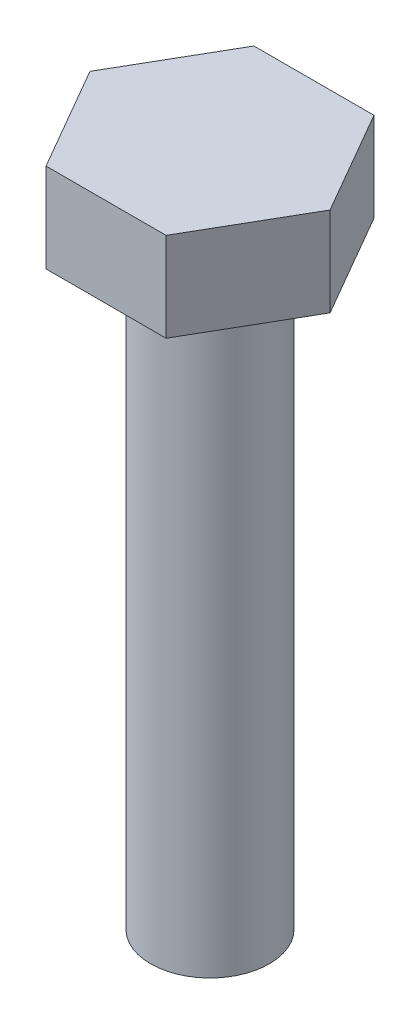
ISO-10303-21;
HEADER;
FILE_DESCRIPTION(('STEP AP214'),'2;1');
FILE_NAME('part.step','',(''),(''),'','','');
FILE_SCHEMA(('AUTOMOTIVE_DESIGN { 1 0 10303 214 1 1 1 1 }'));
ENDSEC;
DATA;
#1=APPLICATION_CONTEXT('core data for automotive mechanical design processes');
#2=APPLICATION_PROTOCOL_DEFINITION('international standard','automotive_design',2000,#1);
#3=PRODUCT_CONTEXT('',#1,'mechanical');
#4=PRODUCT('Part','Part','',(#3));
#5=PRODUCT_RELATED_PRODUCT_CATEGORY('part','',(#4));
#6=PRODUCT_DEFINITION_FORMATION('','',#4);
#7=PRODUCT_DEFINITION_CONTEXT('part definition',#1,'design');
#8=PRODUCT_DEFINITION('design','',#6,#7);
#9=PRODUCT_DEFINITION_SHAPE('','',#8);
#10=(LENGTH_UNIT() NAMED_UNIT(*) SI_UNIT(.MILLI.,.METRE.));
#11=(NAMED_UNIT(*) PLANE_ANGLE_UNIT() SI_UNIT($,.RADIAN.));
#12=(NAMED_UNIT(*) SI_UNIT($,.STERADIAN.) SOLID_ANGLE_UNIT());
#13=UNCERTAINTY_MEASURE_WITH_UNIT(LENGTH_MEASURE(1.E-05),#10,'distance_accuracy_value','');
#14=(GEOMETRIC_REPRESENTATION_CONTEXT(3) GLOBAL_UNCERTAINTY_ASSIGNED_CONTEXT((#13)) GLOBAL_UNIT_ASSIGNED_CONTEXT((#10,
#11,#12)) REPRESENTATION_CONTEXT('',''));
#15=CARTESIAN_POINT('',(0.,0.,0.));
#16=DIRECTION('',(0.,0.,1.));
#17=DIRECTION('',(1.,0.,0.));
#18=AXIS2_PLACEMENT_3D('',#15,#16,#17);
#19=CARTESIAN_POINT('',(0.,20.,0.));
#20=DIRECTION('',(0.,-1.,0.));
#21=DIRECTION('',(0.,0.,-1.));
#22=AXIS2_PLACEMENT_3D('',#19,#20,#21);
#23=CYLINDRICAL_SURFACE('',#22,2.);
#24=CARTESIAN_POINT('',(0.,20.,0.));
#25=DIRECTION('',(0.,1.,0.));
#26=DIRECTION('',(0.,0.,1.));
#27=AXIS2_PLACEMENT_3D('',#24,#25,#26);
#28=CIRCLE('',#27,2.);
#29=CARTESIAN_POINT('',(0.,20.,2.));
#30=VERTEX_POINT('',#29);
#31=EDGE_CURVE('E11',#30,#30,#28,.T.);
#32=ORIENTED_EDGE('',*,*,#31,.F.);
#33=EDGE_LOOP('',(#32));
#34=FACE_BOUND('',#33,.T.);
#35=CARTESIAN_POINT('',(0.,0.,0.));
#36=DIRECTION('',(0.,1.,0.));
#37=DIRECTION('',(0.,0.,1.));
#38=AXIS2_PLACEMENT_3D('',#35,#36,#37);
#39=CIRCLE('',#38,2.);
#40=CARTESIAN_POINT('',(0.,0.,2.));
#41=VERTEX_POINT('',#40);
#42=EDGE_CURVE('E40',#41,#41,#39,.T.);
#43=ORIENTED_EDGE('',*,*,#42,.T.);
#44=EDGE_LOOP('',(#43));
#45=FACE_BOUND('',#44,.T.);
#46=ADVANCED_FACE('F37',(#34,#45),#23,.T.);
#47=CARTESIAN_POINT('',(0.,0.,0.));
#48=DIRECTION('',(0.,1.,0.));
#49=DIRECTION('',(0.,0.,1.));
#50=AXIS2_PLACEMENT_3D('',#47,#48,#49);
#51=PLANE('',#50);
#52=ORIENTED_EDGE('',*,*,#42,.F.);
#53=EDGE_LOOP('',(#52));
#54=FACE_BOUND('',#53,.T.);
#55=ADVANCED_FACE('F145',(#54),#51,.F.);
#56=CARTESIAN_POINT('',(2.02072594216369,23.,3.5));
#57=DIRECTION('',(-0.866025403784439,0.,-0.5));
#58=DIRECTION('',(-0.5,0.,0.866025403784439));
#59=AXIS2_PLACEMENT_3D('',#56,#57,#58);
#60=PLANE('',#59);
#61=DIRECTION('',(0.5,0.,-0.866025403784439));
#62=VECTOR('',#61,1.);
#63=CARTESIAN_POINT('',(2.02072594216369,20.,3.5));
#64=LINE('',#63,#62);
#65=CARTESIAN_POINT('',(2.02072594216369,20.,3.5));
#66=VERTEX_POINT('',#65);
#67=CARTESIAN_POINT('',(4.04145188432738,20.,0.));
#68=VERTEX_POINT('',#67);
#69=EDGE_CURVE('E122',#66,#68,#64,.T.);
#70=ORIENTED_EDGE('',*,*,#69,.T.);
#71=DIRECTION('',(0.,-1.,0.));
#72=VECTOR('',#71,1.);
#73=CARTESIAN_POINT('',(4.04145188432738,23.,0.));
#74=LINE('',#73,#72);
#75=CARTESIAN_POINT('',(4.04145188432738,23.,0.));
#76=VERTEX_POINT('',#75);
#77=EDGE_CURVE('E139',#76,#68,#74,.T.);
#78=ORIENTED_EDGE('',*,*,#77,.F.);
#79=DIRECTION('',(0.5,0.,-0.866025403784439));
#80=VECTOR('',#79,1.);
#81=CARTESIAN_POINT('',(2.02072594216369,23.,3.5));
#82=LINE('',#81,#80);
#83=CARTESIAN_POINT('',(2.02072594216369,23.,3.5));
#84=VERTEX_POINT('',#83);
#85=EDGE_CURVE('E132',#84,#76,#82,.T.);
#86=ORIENTED_EDGE('',*,*,#85,.F.);
#87=DIRECTION('',(0.,-1.,0.));
#88=VECTOR('',#87,1.);
#89=CARTESIAN_POINT('',(2.02072594216369,23.,3.5));
#90=LINE('',#89,#88);
#91=EDGE_CURVE('E118',#84,#66,#90,.T.);
#92=ORIENTED_EDGE('',*,*,#91,.T.);
#93=EDGE_LOOP('',(#70,#78,#86,#92));
#94=FACE_BOUND('',#93,.T.);
#95=ADVANCED_FACE('F147',(#94),#60,.F.);
#96=CARTESIAN_POINT('',(4.04145188432738,23.,0.));
#97=DIRECTION('',(-0.866025403784438,0.,0.5));
#98=DIRECTION('',(0.5,0.,0.866025403784439));
#99=AXIS2_PLACEMENT_3D('',#96,#97,#98);
#100=PLANE('',#99);
#101=DIRECTION('',(-0.5,0.,-0.866025403784439));
#102=VECTOR('',#101,1.);
#103=CARTESIAN_POINT('',(4.04145188432738,20.,0.));
#104=LINE('',#103,#102);
#105=CARTESIAN_POINT('',(2.02072594216369,20.,-3.5));
#106=VERTEX_POINT('',#105);
#107=EDGE_CURVE('E125',#68,#106,#104,.T.);
#108=ORIENTED_EDGE('',*,*,#107,.T.);
#109=DIRECTION('',(0.,-1.,0.));
#110=VECTOR('',#109,1.);
#111=CARTESIAN_POINT('',(2.02072594216369,23.,-3.5));
#112=LINE('',#111,#110);
#113=CARTESIAN_POINT('',(2.02072594216369,23.,-3.5));
#114=VERTEX_POINT('',#113);
#115=EDGE_CURVE('E136',#114,#106,#112,.T.);
#116=ORIENTED_EDGE('',*,*,#115,.F.);
#117=DIRECTION('',(-0.5,0.,-0.866025403784439));
#118=VECTOR('',#117,1.);
#119=CARTESIAN_POINT('',(4.04145188432738,23.,0.));
#120=LINE('',#119,#118);
#121=EDGE_CURVE('E91',#76,#114,#120,.T.);
#122=ORIENTED_EDGE('',*,*,#121,.F.);
#123=ORIENTED_EDGE('',*,*,#77,.T.);
#124=EDGE_LOOP('',(#108,#116,#122,#123));
#125=FACE_BOUND('',#124,.T.);
#126=ADVANCED_FACE('F152',(#125),#100,.F.);
#127=CARTESIAN_POINT('',(2.02072594216369,23.,-3.5));
#128=DIRECTION('',(0.,0.,1.));
#129=DIRECTION('',(1.,0.,0.));
#130=AXIS2_PLACEMENT_3D('',#127,#128,#129);
#131=PLANE('',#130);
#132=DIRECTION('',(-1.,0.,0.));
#133=VECTOR('',#132,1.);
#134=CARTESIAN_POINT('',(2.02072594216369,20.,-3.5));
#135=LINE('',#134,#133);
#136=CARTESIAN_POINT('',(-2.02072594216369,20.,-3.5));
#137=VERTEX_POINT('',#136);
#138=EDGE_CURVE('E127',#106,#137,#135,.T.);
#139=ORIENTED_EDGE('',*,*,#138,.T.);
#140=DIRECTION('',(0.,-1.,0.));
#141=VECTOR('',#140,1.);
#142=CARTESIAN_POINT('',(-2.02072594216369,23.,-3.5));
#143=LINE('',#142,#141);
#144=CARTESIAN_POINT('',(-2.02072594216369,23.,-3.5));
#145=VERTEX_POINT('',#144);
#146=EDGE_CURVE('E113',#145,#137,#143,.T.);
#147=ORIENTED_EDGE('',*,*,#146,.F.);
#148=DIRECTION('',(-1.,0.,0.));
#149=VECTOR('',#148,1.);
#150=CARTESIAN_POINT('',(2.02072594216369,23.,-3.5));
#151=LINE('',#150,#149);
#152=EDGE_CURVE('E104',#114,#145,#151,.T.);
#153=ORIENTED_EDGE('',*,*,#152,.F.);
#154=ORIENTED_EDGE('',*,*,#115,.T.);
#155=EDGE_LOOP('',(#139,#147,#153,#154));
#156=FACE_BOUND('',#155,.T.);
#157=ADVANCED_FACE('F159',(#156),#131,.F.);
#158=CARTESIAN_POINT('',(-2.02072594216369,23.,-3.5));
#159=DIRECTION('',(0.866025403784439,0.,0.5));
#160=DIRECTION('',(0.5,0.,-0.866025403784439));
#161=AXIS2_PLACEMENT_3D('',#158,#159,#160);
#162=PLANE('',#161);
#163=DIRECTION('',(-0.5,0.,0.866025403784439));
#164=VECTOR('',#163,1.);
#165=CARTESIAN_POINT('',(-2.02072594216369,20.,-3.5));
#166=LINE('',#165,#164);
#167=CARTESIAN_POINT('',(-4.04145188432738,20.,0.));
#168=VERTEX_POINT('',#167);
#169=EDGE_CURVE('E112',#137,#168,#166,.T.);
#170=ORIENTED_EDGE('',*,*,#169,.T.);
#171=DIRECTION('',(0.,-1.,0.));
#172=VECTOR('',#171,1.);
#173=CARTESIAN_POINT('',(-4.04145188432738,23.,0.));
#174=LINE('',#173,#172);
#175=CARTESIAN_POINT('',(-4.04145188432738,23.,0.));
#176=VERTEX_POINT('',#175);
#177=EDGE_CURVE('E109',#176,#168,#174,.T.);
#178=ORIENTED_EDGE('',*,*,#177,.F.);
#179=DIRECTION('',(-0.5,0.,0.866025403784439));
#180=VECTOR('',#179,1.);
#181=CARTESIAN_POINT('',(-2.02072594216369,23.,-3.5));
#182=LINE('',#181,#180);
#183=EDGE_CURVE('E98',#145,#176,#182,.T.);
#184=ORIENTED_EDGE('',*,*,#183,.F.);
#185=ORIENTED_EDGE('',*,*,#146,.T.);
#186=EDGE_LOOP('',(#170,#178,#184,#185));
#187=FACE_BOUND('',#186,.T.);
#188=ADVANCED_FACE('F110',(#187),#162,.F.);
#189=CARTESIAN_POINT('',(-4.04145188432738,23.,0.));
#190=DIRECTION('',(0.866025403784439,0.,-0.5));
#191=DIRECTION('',(-0.5,0.,-0.866025403784439));
#192=AXIS2_PLACEMENT_3D('',#189,#190,#191);
#193=PLANE('',#192);
#194=DIRECTION('',(0.5,0.,0.866025403784438));
#195=VECTOR('',#194,1.);
#196=CARTESIAN_POINT('',(-4.04145188432738,20.,0.));
#197=LINE('',#196,#195);
#198=CARTESIAN_POINT('',(-2.02072594216369,20.,3.5));
#199=VERTEX_POINT('',#198);
#200=EDGE_CURVE('E76',#168,#199,#197,.T.);
#201=ORIENTED_EDGE('',*,*,#200,.T.);
#202=DIRECTION('',(0.,-1.,0.));
#203=VECTOR('',#202,1.);
#204=CARTESIAN_POINT('',(-2.02072594216369,23.,3.5));
#205=LINE('',#204,#203);
#206=CARTESIAN_POINT('',(-2.02072594216369,23.,3.5));
#207=VERTEX_POINT('',#206);
#208=EDGE_CURVE('E114',#207,#199,#205,.T.);
#209=ORIENTED_EDGE('',*,*,#208,.F.);
#210=DIRECTION('',(0.5,0.,0.866025403784438));
#211=VECTOR('',#210,1.);
#212=CARTESIAN_POINT('',(-4.04145188432738,23.,0.));
#213=LINE('',#212,#211);
#214=EDGE_CURVE('E102',#176,#207,#213,.T.);
#215=ORIENTED_EDGE('',*,*,#214,.F.);
#216=ORIENTED_EDGE('',*,*,#177,.T.);
#217=EDGE_LOOP('',(#201,#209,#215,#216));
#218=FACE_BOUND('',#217,.T.);
#219=ADVANCED_FACE('F116',(#218),#193,.F.);
#220=CARTESIAN_POINT('',(-2.02072594216369,23.,3.5));
#221=DIRECTION('',(0.,0.,-1.));
#222=DIRECTION('',(-1.,0.,0.));
#223=AXIS2_PLACEMENT_3D('',#220,#221,#222);
#224=PLANE('',#223);
#225=DIRECTION('',(1.,0.,0.));
#226=VECTOR('',#225,1.);
#227=CARTESIAN_POINT('',(-2.02072594216369,20.,3.5));
#228=LINE('',#227,#226);
#229=EDGE_CURVE('E82',#199,#66,#228,.T.);
#230=ORIENTED_EDGE('',*,*,#229,.T.);
#231=ORIENTED_EDGE('',*,*,#91,.F.);
#232=DIRECTION('',(1.,0.,0.));
#233=VECTOR('',#232,1.);
#234=CARTESIAN_POINT('',(-2.02072594216369,23.,3.5));
#235=LINE('',#234,#233);
#236=EDGE_CURVE('E53',#207,#84,#235,.T.);
#237=ORIENTED_EDGE('',*,*,#236,.F.);
#238=ORIENTED_EDGE('',*,*,#208,.T.);
#239=EDGE_LOOP('',(#230,#231,#237,#238));
#240=FACE_BOUND('',#239,.T.);
#241=ADVANCED_FACE('F167',(#240),#224,.F.);
#242=CARTESIAN_POINT('',(0.,23.,0.));
#243=DIRECTION('',(0.,1.,0.));
#244=DIRECTION('',(0.,0.,1.));
#245=AXIS2_PLACEMENT_3D('',#242,#243,#244);
#246=PLANE('',#245);
#247=ORIENTED_EDGE('',*,*,#85,.T.);
#248=ORIENTED_EDGE('',*,*,#121,.T.);
#249=ORIENTED_EDGE('',*,*,#152,.T.);
#250=ORIENTED_EDGE('',*,*,#183,.T.);
#251=ORIENTED_EDGE('',*,*,#214,.T.);
#252=ORIENTED_EDGE('',*,*,#236,.T.);
#253=EDGE_LOOP('',(#247,#248,#249,#250,#251,#252));
#254=FACE_BOUND('',#253,.T.);
#255=ADVANCED_FACE('F100',(#254),#246,.T.);
#256=CARTESIAN_POINT('',(0.,20.,0.));
#257=DIRECTION('',(0.,1.,0.));
#258=DIRECTION('',(0.,0.,1.));
#259=AXIS2_PLACEMENT_3D('',#256,#257,#258);
#260=PLANE('',#259);
#261=ORIENTED_EDGE('',*,*,#31,.T.);
#262=EDGE_LOOP('',(#261));
#263=FACE_BOUND('',#262,.T.);
#264=ORIENTED_EDGE('',*,*,#69,.F.);
#265=ORIENTED_EDGE('',*,*,#229,.F.);
#266=ORIENTED_EDGE('',*,*,#200,.F.);
#267=ORIENTED_EDGE('',*,*,#169,.F.);
#268=ORIENTED_EDGE('',*,*,#138,.F.);
#269=ORIENTED_EDGE('',*,*,#107,.F.);
#270=EDGE_LOOP('',(#264,#265,#266,#267,#268,#269));
#271=FACE_BOUND('',#270,.T.);
#272=ADVANCED_FACE('F170',(#263,#271),#260,.F.);
#273=CLOSED_SHELL('',(#46,#55,#95,#126,#157,#188,#219,#241,#255,#272));
#274=MANIFOLD_SOLID_BREP('B2',#273);
#275=ADVANCED_BREP_SHAPE_REPRESENTATION('',(#18,#274),#14);
#276=SHAPE_DEFINITION_REPRESENTATION(#9,#275);
ENDSEC;
END-ISO-10303-21;
